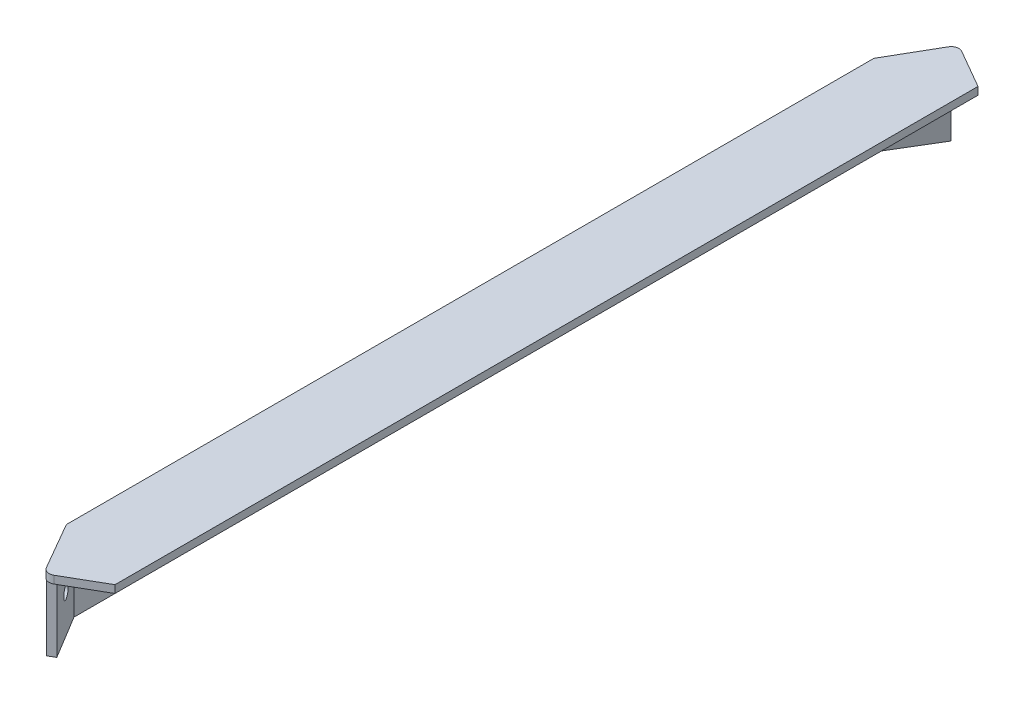
ISO-10303-21;
HEADER;
FILE_DESCRIPTION(('STEP AP214'),'2;1');
FILE_NAME('part.step','',(''),(''),'','','');
FILE_SCHEMA(('AUTOMOTIVE_DESIGN { 1 0 10303 214 1 1 1 1 }'));
ENDSEC;
DATA;
#1=APPLICATION_CONTEXT('core data for automotive mechanical design processes');
#2=APPLICATION_PROTOCOL_DEFINITION('international standard','automotive_design',2000,#1);
#3=PRODUCT_CONTEXT('',#1,'mechanical');
#4=PRODUCT('Part','Part','',(#3));
#5=PRODUCT_RELATED_PRODUCT_CATEGORY('part','',(#4));
#6=PRODUCT_DEFINITION_FORMATION('','',#4);
#7=PRODUCT_DEFINITION_CONTEXT('part definition',#1,'design');
#8=PRODUCT_DEFINITION('design','',#6,#7);
#9=PRODUCT_DEFINITION_SHAPE('','',#8);
#10=(LENGTH_UNIT() NAMED_UNIT(*) SI_UNIT(.MILLI.,.METRE.));
#11=(NAMED_UNIT(*) PLANE_ANGLE_UNIT() SI_UNIT($,.RADIAN.));
#12=(NAMED_UNIT(*) SI_UNIT($,.STERADIAN.) SOLID_ANGLE_UNIT());
#13=UNCERTAINTY_MEASURE_WITH_UNIT(LENGTH_MEASURE(1.E-05),#10,'distance_accuracy_value','');
#14=(GEOMETRIC_REPRESENTATION_CONTEXT(3) GLOBAL_UNCERTAINTY_ASSIGNED_CONTEXT((#13)) GLOBAL_UNIT_ASSIGNED_CONTEXT((#10,
#11,#12)) REPRESENTATION_CONTEXT('',''));
#15=CARTESIAN_POINT('',(0.,0.,0.));
#16=DIRECTION('',(0.,0.,1.));
#17=DIRECTION('',(1.,0.,0.));
#18=AXIS2_PLACEMENT_3D('',#15,#16,#17);
#19=CARTESIAN_POINT('',(7.,0.,370.));
#20=DIRECTION('',(0.,1.,0.));
#21=DIRECTION('',(-1.,0.,0.));
#22=AXIS2_PLACEMENT_3D('',#19,#20,#21);
#23=PLANE('',#22);
#24=DIRECTION('',(0.,0.,-1.));
#25=VECTOR('',#24,1.);
#26=CARTESIAN_POINT('',(0.,0.,370.));
#27=LINE('',#26,#25);
#28=CARTESIAN_POINT('',(0.,0.,370.));
#29=VERTEX_POINT('',#28);
#30=CARTESIAN_POINT('',(0.,0.,-370.));
#31=VERTEX_POINT('',#30);
#32=EDGE_CURVE('E305',#29,#31,#27,.T.);
#33=ORIENTED_EDGE('',*,*,#32,.T.);
#34=DIRECTION('',(0.499999999999995,0.,-0.866025403784442));
#35=VECTOR('',#34,1.);
#36=CARTESIAN_POINT('',(0.,0.,-370.));
#37=LINE('',#36,#35);
#38=CARTESIAN_POINT('',(24.9999999999997,0.,-413.301270189222));
#39=VERTEX_POINT('',#38);
#40=EDGE_CURVE('E165',#31,#39,#37,.T.);
#41=ORIENTED_EDGE('',*,*,#40,.T.);
#42=DIRECTION('',(0.866025403784445,0.,0.49999999999999));
#43=VECTOR('',#42,1.);
#44=CARTESIAN_POINT('',(24.9999999999997,0.,-413.301270189222));
#45=LINE('',#44,#43);
#46=CARTESIAN_POINT('',(31.0621778264906,0.,-409.801270189222));
#47=VERTEX_POINT('',#46);
#48=EDGE_CURVE('E209',#39,#47,#45,.T.);
#49=ORIENTED_EDGE('',*,*,#48,.T.);
#50=DIRECTION('',(-0.517360980401761,0.,0.855767267402609));
#51=VECTOR('',#50,1.);
#52=CARTESIAN_POINT('',(31.0621778264906,0.,-409.801270189222));
#53=LINE('',#52,#51);
#54=CARTESIAN_POINT('',(7.,0.,-370.));
#55=VERTEX_POINT('',#54);
#56=EDGE_CURVE('E205',#47,#55,#53,.T.);
#57=ORIENTED_EDGE('',*,*,#56,.T.);
#58=DIRECTION('',(0.,0.,-1.));
#59=VECTOR('',#58,1.);
#60=CARTESIAN_POINT('',(7.,0.,370.));
#61=LINE('',#60,#59);
#62=CARTESIAN_POINT('',(7.,0.,370.));
#63=VERTEX_POINT('',#62);
#64=EDGE_CURVE('E317',#63,#55,#61,.T.);
#65=ORIENTED_EDGE('',*,*,#64,.F.);
#66=DIRECTION('',(-0.517360980401761,0.,-0.855767267402609));
#67=VECTOR('',#66,1.);
#68=CARTESIAN_POINT('',(31.0621778264906,0.,409.801270189222));
#69=LINE('',#68,#67);
#70=CARTESIAN_POINT('',(31.0621778264906,0.,409.801270189222));
#71=VERTEX_POINT('',#70);
#72=EDGE_CURVE('E283',#71,#63,#69,.T.);
#73=ORIENTED_EDGE('',*,*,#72,.F.);
#74=DIRECTION('',(0.866025403784445,0.,-0.49999999999999));
#75=VECTOR('',#74,1.);
#76=CARTESIAN_POINT('',(24.9999999999997,0.,413.301270189222));
#77=LINE('',#76,#75);
#78=CARTESIAN_POINT('',(24.9999999999997,0.,413.301270189222));
#79=VERTEX_POINT('',#78);
#80=EDGE_CURVE('E286',#79,#71,#77,.T.);
#81=ORIENTED_EDGE('',*,*,#80,.F.);
#82=DIRECTION('',(0.499999999999995,0.,0.866025403784442));
#83=VECTOR('',#82,1.);
#84=CARTESIAN_POINT('',(0.,0.,370.));
#85=LINE('',#84,#83);
#86=EDGE_CURVE('E278',#29,#79,#85,.T.);
#87=ORIENTED_EDGE('',*,*,#86,.F.);
#88=EDGE_LOOP('',(#33,#41,#49,#57,#65,#73,#81,#87));
#89=FACE_BOUND('',#88,.T.);
#90=ADVANCED_FACE('F45',(#89),#23,.F.);
#91=CARTESIAN_POINT('',(6.99999999999999,63.,370.));
#92=DIRECTION('',(-1.,0.,0.));
#93=DIRECTION('',(0.,-1.,0.));
#94=AXIS2_PLACEMENT_3D('',#91,#92,#93);
#95=PLANE('',#94);
#96=ORIENTED_EDGE('',*,*,#64,.T.);
#97=DIRECTION('',(0.,1.,0.));
#98=VECTOR('',#97,1.);
#99=CARTESIAN_POINT('',(6.99999999999999,63.,-370.));
#100=LINE('',#99,#98);
#101=CARTESIAN_POINT('',(6.99999999999999,58.,-370.));
#102=VERTEX_POINT('',#101);
#103=EDGE_CURVE('E221',#55,#102,#100,.T.);
#104=ORIENTED_EDGE('',*,*,#103,.T.);
#105=DIRECTION('',(0.,0.,-1.));
#106=VECTOR('',#105,1.);
#107=CARTESIAN_POINT('',(6.99999999999999,58.,370.));
#108=LINE('',#107,#106);
#109=CARTESIAN_POINT('',(6.99999999999999,58.,370.));
#110=VERTEX_POINT('',#109);
#111=EDGE_CURVE('E55',#102,#110,#108,.F.);
#112=ORIENTED_EDGE('',*,*,#111,.T.);
#113=DIRECTION('',(0.,1.,0.));
#114=VECTOR('',#113,1.);
#115=CARTESIAN_POINT('',(6.99999999999999,63.,370.));
#116=LINE('',#115,#114);
#117=EDGE_CURVE('E299',#63,#110,#116,.T.);
#118=ORIENTED_EDGE('',*,*,#117,.F.);
#119=EDGE_LOOP('',(#96,#104,#112,#118));
#120=FACE_BOUND('',#119,.T.);
#121=ADVANCED_FACE('F355',(#120),#95,.F.);
#122=CARTESIAN_POINT('',(70.,63.,370.));
#123=DIRECTION('',(0.,1.,0.));
#124=DIRECTION('',(-1.,0.,0.));
#125=AXIS2_PLACEMENT_3D('',#122,#123,#124);
#126=PLANE('',#125);
#127=DIRECTION('',(0.866025403784445,0.,-0.49999999999999));
#128=VECTOR('',#127,1.);
#129=CARTESIAN_POINT('',(24.9999999999997,63.,413.301270189222));
#130=LINE('',#129,#128);
#131=CARTESIAN_POINT('',(24.9999999999997,63.,413.301270189222));
#132=VERTEX_POINT('',#131);
#133=CARTESIAN_POINT('',(35.3931854107218,63.,407.300761794604));
#134=VERTEX_POINT('',#133);
#135=EDGE_CURVE('E279',#132,#134,#130,.T.);
#136=ORIENTED_EDGE('',*,*,#135,.T.);
#137=DIRECTION('',(-0.517360980401761,0.,-0.855767267402609));
#138=VECTOR('',#137,1.);
#139=CARTESIAN_POINT('',(11.2788363370131,63.,367.413195097991));
#140=LINE('',#139,#138);
#141=CARTESIAN_POINT('',(12.,63.,368.606072567693));
#142=VERTEX_POINT('',#141);
#143=EDGE_CURVE('E323',#134,#142,#140,.T.);
#144=ORIENTED_EDGE('',*,*,#143,.T.);
#145=DIRECTION('',(0.,0.,-1.));
#146=VECTOR('',#145,1.);
#147=CARTESIAN_POINT('',(12.,63.,0.));
#148=LINE('',#147,#146);
#149=CARTESIAN_POINT('',(12.,63.,-368.606072567693));
#150=VERTEX_POINT('',#149);
#151=EDGE_CURVE('E320',#142,#150,#148,.T.);
#152=ORIENTED_EDGE('',*,*,#151,.T.);
#153=DIRECTION('',(-0.517360980401761,0.,0.855767267402609));
#154=VECTOR('',#153,1.);
#155=CARTESIAN_POINT('',(11.2788363370131,63.,-367.413195097991));
#156=LINE('',#155,#154);
#157=CARTESIAN_POINT('',(35.3931854107218,63.,-407.300761794604));
#158=VERTEX_POINT('',#157);
#159=EDGE_CURVE('E226',#158,#150,#156,.T.);
#160=ORIENTED_EDGE('',*,*,#159,.F.);
#161=DIRECTION('',(0.866025403784445,0.,0.49999999999999));
#162=VECTOR('',#161,1.);
#163=CARTESIAN_POINT('',(24.9999999999997,63.,-413.301270189222));
#164=LINE('',#163,#162);
#165=CARTESIAN_POINT('',(24.9999999999997,63.,-413.301270189222));
#166=VERTEX_POINT('',#165);
#167=EDGE_CURVE('E200',#166,#158,#164,.T.);
#168=ORIENTED_EDGE('',*,*,#167,.F.);
#169=CARTESIAN_POINT('',(31.0621778264908,63.,-409.801270189222));
#170=DIRECTION('',(0.,-1.,0.));
#171=DIRECTION('',(0.,0.,-1.));
#172=AXIS2_PLACEMENT_3D('',#169,#170,#171);
#173=CIRCLE('',#172,7.00000000000001);
#174=CARTESIAN_POINT('',(34.5621778264907,63.,-415.863448015713));
#175=VERTEX_POINT('',#174);
#176=EDGE_CURVE('E161',#166,#175,#173,.T.);
#177=ORIENTED_EDGE('',*,*,#176,.T.);
#178=DIRECTION('',(0.866025403784439,0.,0.499999999999999));
#179=VECTOR('',#178,1.);
#180=CARTESIAN_POINT('',(34.5621778264908,63.,-415.863448015713));
#181=LINE('',#180,#179);
#182=CARTESIAN_POINT('',(69.9999999999999,63.,-395.403411844343));
#183=VERTEX_POINT('',#182);
#184=EDGE_CURVE('E177',#175,#183,#181,.T.);
#185=ORIENTED_EDGE('',*,*,#184,.T.);
#186=DIRECTION('',(0.,0.,-1.));
#187=VECTOR('',#186,1.);
#188=CARTESIAN_POINT('',(70.,63.,370.));
#189=LINE('',#188,#187);
#190=CARTESIAN_POINT('',(69.9999999999999,63.,395.403411844343));
#191=VERTEX_POINT('',#190);
#192=EDGE_CURVE('E314',#191,#183,#189,.T.);
#193=ORIENTED_EDGE('',*,*,#192,.F.);
#194=DIRECTION('',(0.866025403784439,0.,-0.499999999999999));
#195=VECTOR('',#194,1.);
#196=CARTESIAN_POINT('',(34.5621778264908,63.,415.863448015713));
#197=LINE('',#196,#195);
#198=CARTESIAN_POINT('',(34.5621778264907,63.,415.863448015713));
#199=VERTEX_POINT('',#198);
#200=EDGE_CURVE('E254',#199,#191,#197,.T.);
#201=ORIENTED_EDGE('',*,*,#200,.F.);
#202=CARTESIAN_POINT('',(31.0621778264908,63.,409.801270189222));
#203=DIRECTION('',(0.,1.,0.));
#204=DIRECTION('',(0.,0.,1.));
#205=AXIS2_PLACEMENT_3D('',#202,#203,#204);
#206=CIRCLE('',#205,7.00000000000001);
#207=EDGE_CURVE('E249',#132,#199,#206,.T.);
#208=ORIENTED_EDGE('',*,*,#207,.F.);
#209=EDGE_LOOP('',(#136,#144,#152,#160,#168,#177,#185,#193,#201,#208));
#210=FACE_BOUND('',#209,.T.);
#211=ADVANCED_FACE('F341',(#210),#126,.F.);
#212=CARTESIAN_POINT('',(70.,70.,370.));
#213=DIRECTION('',(-1.,0.,0.));
#214=DIRECTION('',(0.,0.,1.));
#215=AXIS2_PLACEMENT_3D('',#212,#213,#214);
#216=PLANE('',#215);
#217=ORIENTED_EDGE('',*,*,#192,.T.);
#218=DIRECTION('',(0.,-1.,0.));
#219=VECTOR('',#218,1.);
#220=CARTESIAN_POINT('',(69.9999999999999,70.,-395.403411844343));
#221=LINE('',#220,#219);
#222=CARTESIAN_POINT('',(69.9999999999999,70.,-395.403411844343));
#223=VERTEX_POINT('',#222);
#224=EDGE_CURVE('E185',#223,#183,#221,.T.);
#225=ORIENTED_EDGE('',*,*,#224,.F.);
#226=DIRECTION('',(0.,0.,-1.));
#227=VECTOR('',#226,1.);
#228=CARTESIAN_POINT('',(70.,70.,370.));
#229=LINE('',#228,#227);
#230=CARTESIAN_POINT('',(69.9999999999999,70.,395.403411844343));
#231=VERTEX_POINT('',#230);
#232=EDGE_CURVE('E311',#231,#223,#229,.T.);
#233=ORIENTED_EDGE('',*,*,#232,.F.);
#234=DIRECTION('',(0.,-1.,0.));
#235=VECTOR('',#234,1.);
#236=CARTESIAN_POINT('',(69.9999999999999,70.,395.403411844343));
#237=LINE('',#236,#235);
#238=EDGE_CURVE('E261',#231,#191,#237,.T.);
#239=ORIENTED_EDGE('',*,*,#238,.T.);
#240=EDGE_LOOP('',(#217,#225,#233,#239));
#241=FACE_BOUND('',#240,.T.);
#242=ADVANCED_FACE('F387',(#241),#216,.F.);
#243=CARTESIAN_POINT('',(0.,70.,370.));
#244=DIRECTION('',(0.,-1.,0.));
#245=DIRECTION('',(0.,0.,-1.));
#246=AXIS2_PLACEMENT_3D('',#243,#244,#245);
#247=PLANE('',#246);
#248=ORIENTED_EDGE('',*,*,#232,.T.);
#249=DIRECTION('',(0.866025403784439,0.,0.499999999999999));
#250=VECTOR('',#249,1.);
#251=CARTESIAN_POINT('',(34.5621778264908,70.,-415.863448015713));
#252=LINE('',#251,#250);
#253=CARTESIAN_POINT('',(34.5621778264907,70.,-415.863448015713));
#254=VERTEX_POINT('',#253);
#255=EDGE_CURVE('E181',#254,#223,#252,.T.);
#256=ORIENTED_EDGE('',*,*,#255,.F.);
#257=CARTESIAN_POINT('',(31.0621778264908,70.,-409.801270189222));
#258=DIRECTION('',(0.,-1.,0.));
#259=DIRECTION('',(0.,0.,-1.));
#260=AXIS2_PLACEMENT_3D('',#257,#258,#259);
#261=CIRCLE('',#260,7.00000000000001);
#262=CARTESIAN_POINT('',(24.9999999999997,70.,-413.301270189222));
#263=VERTEX_POINT('',#262);
#264=EDGE_CURVE('E158',#263,#254,#261,.T.);
#265=ORIENTED_EDGE('',*,*,#264,.F.);
#266=DIRECTION('',(0.499999999999996,0.,-0.866025403784441));
#267=VECTOR('',#266,1.);
#268=CARTESIAN_POINT('',(0.,70.,-370.));
#269=LINE('',#268,#267);
#270=CARTESIAN_POINT('',(0.,70.,-370.));
#271=VERTEX_POINT('',#270);
#272=EDGE_CURVE('E170',#271,#263,#269,.T.);
#273=ORIENTED_EDGE('',*,*,#272,.F.);
#274=DIRECTION('',(0.,0.,-1.));
#275=VECTOR('',#274,1.);
#276=CARTESIAN_POINT('',(0.,70.,370.));
#277=LINE('',#276,#275);
#278=CARTESIAN_POINT('',(0.,70.,370.));
#279=VERTEX_POINT('',#278);
#280=EDGE_CURVE('E308',#279,#271,#277,.T.);
#281=ORIENTED_EDGE('',*,*,#280,.F.);
#282=DIRECTION('',(0.499999999999996,0.,0.866025403784441));
#283=VECTOR('',#282,1.);
#284=CARTESIAN_POINT('',(0.,70.,370.));
#285=LINE('',#284,#283);
#286=CARTESIAN_POINT('',(24.9999999999997,70.,413.301270189222));
#287=VERTEX_POINT('',#286);
#288=EDGE_CURVE('E250',#279,#287,#285,.T.);
#289=ORIENTED_EDGE('',*,*,#288,.T.);
#290=CARTESIAN_POINT('',(31.0621778264908,70.,409.801270189222));
#291=DIRECTION('',(0.,1.,0.));
#292=DIRECTION('',(0.,0.,1.));
#293=AXIS2_PLACEMENT_3D('',#290,#291,#292);
#294=CIRCLE('',#293,7.00000000000001);
#295=CARTESIAN_POINT('',(34.5621778264907,70.,415.863448015713));
#296=VERTEX_POINT('',#295);
#297=EDGE_CURVE('E253',#287,#296,#294,.T.);
#298=ORIENTED_EDGE('',*,*,#297,.T.);
#299=DIRECTION('',(0.866025403784439,0.,-0.499999999999999));
#300=VECTOR('',#299,1.);
#301=CARTESIAN_POINT('',(34.5621778264908,70.,415.863448015713));
#302=LINE('',#301,#300);
#303=EDGE_CURVE('E257',#296,#231,#302,.T.);
#304=ORIENTED_EDGE('',*,*,#303,.T.);
#305=EDGE_LOOP('',(#248,#256,#265,#273,#281,#289,#298,#304));
#306=FACE_BOUND('',#305,.T.);
#307=ADVANCED_FACE('F179',(#306),#247,.F.);
#308=CARTESIAN_POINT('',(0.,0.,370.));
#309=DIRECTION('',(1.,0.,0.));
#310=DIRECTION('',(0.,0.,-1.));
#311=AXIS2_PLACEMENT_3D('',#308,#309,#310);
#312=PLANE('',#311);
#313=ORIENTED_EDGE('',*,*,#280,.T.);
#314=DIRECTION('',(0.,-1.,0.));
#315=VECTOR('',#314,1.);
#316=CARTESIAN_POINT('',(0.,0.,-370.));
#317=LINE('',#316,#315);
#318=EDGE_CURVE('E174',#271,#31,#317,.T.);
#319=ORIENTED_EDGE('',*,*,#318,.T.);
#320=ORIENTED_EDGE('',*,*,#32,.F.);
#321=DIRECTION('',(0.,-1.,0.));
#322=VECTOR('',#321,1.);
#323=CARTESIAN_POINT('',(0.,0.,370.));
#324=LINE('',#323,#322);
#325=EDGE_CURVE('E302',#279,#29,#324,.T.);
#326=ORIENTED_EDGE('',*,*,#325,.F.);
#327=EDGE_LOOP('',(#313,#319,#320,#326));
#328=FACE_BOUND('',#327,.T.);
#329=ADVANCED_FACE('F369',(#328),#312,.F.);
#330=CARTESIAN_POINT('',(0.,63.,370.));
#331=DIRECTION('',(0.866025403784442,0.,-0.499999999999995));
#332=DIRECTION('',(-0.499999999999995,0.,-0.866025403784442));
#333=AXIS2_PLACEMENT_3D('',#330,#331,#332);
#334=PLANE('',#333);
#335=CARTESIAN_POINT('',(12.568046792657,35.,391.768495596785));
#336=DIRECTION('',(0.866025403784442,0.,-0.499999999999995));
#337=DIRECTION('',(-0.499999999999995,0.,-0.866025403784442));
#338=AXIS2_PLACEMENT_3D('',#335,#336,#337);
#339=ELLIPSE('',#338,6.00122014708367,6.00000000000002);
#340=CARTESIAN_POINT('',(9.56743671911518,35.,386.571286495708));
#341=VERTEX_POINT('',#340);
#342=EDGE_CURVE('E245',#341,#341,#339,.T.);
#343=ORIENTED_EDGE('',*,*,#342,.T.);
#344=EDGE_LOOP('',(#343));
#345=FACE_BOUND('',#344,.T.);
#346=ORIENTED_EDGE('',*,*,#86,.T.);
#347=DIRECTION('',(0.,-1.,0.));
#348=VECTOR('',#347,1.);
#349=CARTESIAN_POINT('',(24.9999999999997,63.,413.301270189222));
#350=LINE('',#349,#348);
#351=EDGE_CURVE('E295',#132,#79,#350,.T.);
#352=ORIENTED_EDGE('',*,*,#351,.F.);
#353=DIRECTION('',(0.,-1.,0.));
#354=VECTOR('',#353,1.);
#355=CARTESIAN_POINT('',(24.9999999999997,70.,413.301270189222));
#356=LINE('',#355,#354);
#357=EDGE_CURVE('E274',#287,#132,#356,.T.);
#358=ORIENTED_EDGE('',*,*,#357,.F.);
#359=ORIENTED_EDGE('',*,*,#288,.F.);
#360=ORIENTED_EDGE('',*,*,#325,.T.);
#361=EDGE_LOOP('',(#346,#352,#358,#359,#360));
#362=FACE_BOUND('',#361,.T.);
#363=ADVANCED_FACE('F375',(#345,#362),#334,.F.);
#364=CARTESIAN_POINT('',(24.9999999999997,63.,413.301270189222));
#365=DIRECTION('',(-0.49999999999999,0.,-0.866025403784445));
#366=DIRECTION('',(-0.866025403784445,0.,0.49999999999999));
#367=AXIS2_PLACEMENT_3D('',#364,#365,#366);
#368=PLANE('',#367);
#369=ORIENTED_EDGE('',*,*,#80,.T.);
#370=DIRECTION('',(0.,-1.,0.));
#371=VECTOR('',#370,1.);
#372=CARTESIAN_POINT('',(31.0621778264906,63.,409.801270189222));
#373=LINE('',#372,#371);
#374=CARTESIAN_POINT('',(31.0621778264906,58.,409.801270189222));
#375=VERTEX_POINT('',#374);
#376=EDGE_CURVE('E282',#375,#71,#373,.T.);
#377=ORIENTED_EDGE('',*,*,#376,.F.);
#378=CARTESIAN_POINT('',(35.3931854107218,58.,407.300761794604));
#379=DIRECTION('',(-0.49999999999999,0.,-0.866025403784445));
#380=DIRECTION('',(0.866025403784445,0.,-0.49999999999999));
#381=AXIS2_PLACEMENT_3D('',#378,#379,#380);
#382=ELLIPSE('',#381,5.00101678923638,5.);
#383=EDGE_CURVE('E11',#375,#134,#382,.T.);
#384=ORIENTED_EDGE('',*,*,#383,.T.);
#385=ORIENTED_EDGE('',*,*,#135,.F.);
#386=ORIENTED_EDGE('',*,*,#351,.T.);
#387=EDGE_LOOP('',(#369,#377,#384,#385,#386));
#388=FACE_BOUND('',#387,.T.);
#389=ADVANCED_FACE('F346',(#388),#368,.F.);
#390=CARTESIAN_POINT('',(31.0621778264906,63.,409.801270189222));
#391=DIRECTION('',(-0.855767267402609,0.,0.517360980401761));
#392=DIRECTION('',(0.517360980401761,0.,0.855767267402609));
#393=AXIS2_PLACEMENT_3D('',#390,#391,#392);
#394=PLANE('',#393);
#395=CARTESIAN_POINT('',(18.1281533164472,35.,388.407088504157));
#396=DIRECTION('',(0.855767267402608,0.,-0.517360980401763));
#397=DIRECTION('',(-0.517360980401763,0.,-0.855767267402608));
#398=AXIS2_PLACEMENT_3D('',#395,#396,#397);
#399=CIRCLE('',#398,6.00000000000002);
#400=CARTESIAN_POINT('',(15.0239874340366,35.,383.272484899741));
#401=VERTEX_POINT('',#400);
#402=EDGE_CURVE('E241',#401,#401,#399,.T.);
#403=ORIENTED_EDGE('',*,*,#402,.F.);
#404=EDGE_LOOP('',(#403));
#405=FACE_BOUND('',#404,.T.);
#406=ORIENTED_EDGE('',*,*,#117,.T.);
#407=DIRECTION('',(-0.517360980401761,0.,-0.855767267402609));
#408=VECTOR('',#407,1.);
#409=CARTESIAN_POINT('',(31.0621778264906,58.,409.801270189222));
#410=LINE('',#409,#408);
#411=EDGE_CURVE('E62',#110,#375,#410,.F.);
#412=ORIENTED_EDGE('',*,*,#411,.T.);
#413=ORIENTED_EDGE('',*,*,#376,.T.);
#414=ORIENTED_EDGE('',*,*,#72,.T.);
#415=EDGE_LOOP('',(#406,#412,#413,#414));
#416=FACE_BOUND('',#415,.T.);
#417=ADVANCED_FACE('F349',(#405,#416),#394,.F.);
#418=CARTESIAN_POINT('',(31.0621778264908,70.,409.801270189222));
#419=DIRECTION('',(0.,-1.,0.));
#420=DIRECTION('',(0.,0.,-1.));
#421=AXIS2_PLACEMENT_3D('',#418,#419,#420);
#422=CYLINDRICAL_SURFACE('',#421,7.00000000000001);
#423=ORIENTED_EDGE('',*,*,#207,.T.);
#424=DIRECTION('',(0.,-1.,0.));
#425=VECTOR('',#424,1.);
#426=CARTESIAN_POINT('',(34.5621778264907,70.,415.863448015713));
#427=LINE('',#426,#425);
#428=EDGE_CURVE('E270',#296,#199,#427,.T.);
#429=ORIENTED_EDGE('',*,*,#428,.F.);
#430=ORIENTED_EDGE('',*,*,#297,.F.);
#431=ORIENTED_EDGE('',*,*,#357,.T.);
#432=EDGE_LOOP('',(#423,#429,#430,#431));
#433=FACE_BOUND('',#432,.T.);
#434=ADVANCED_FACE('F377',(#433),#422,.T.);
#435=CARTESIAN_POINT('',(34.5621778264908,70.,415.863448015713));
#436=DIRECTION('',(-0.499999999999999,0.,-0.866025403784439));
#437=DIRECTION('',(-0.866025403784439,0.,0.499999999999999));
#438=AXIS2_PLACEMENT_3D('',#435,#436,#437);
#439=PLANE('',#438);
#440=ORIENTED_EDGE('',*,*,#200,.T.);
#441=ORIENTED_EDGE('',*,*,#238,.F.);
#442=ORIENTED_EDGE('',*,*,#303,.F.);
#443=ORIENTED_EDGE('',*,*,#428,.T.);
#444=EDGE_LOOP('',(#440,#441,#442,#443));
#445=FACE_BOUND('',#444,.T.);
#446=ADVANCED_FACE('F381',(#445),#439,.F.);
#447=CARTESIAN_POINT('',(12.137782444629,35.,392.028615366969));
#448=DIRECTION('',(0.855767267402608,0.,-0.517360980401763));
#449=DIRECTION('',(-0.517360980401763,0.,-0.855767267402608));
#450=AXIS2_PLACEMENT_3D('',#447,#448,#449);
#451=CYLINDRICAL_SURFACE('',#450,6.00000000000002);
#452=ORIENTED_EDGE('',*,*,#402,.T.);
#453=EDGE_LOOP('',(#452));
#454=FACE_BOUND('',#453,.T.);
#455=ORIENTED_EDGE('',*,*,#342,.F.);
#456=EDGE_LOOP('',(#455));
#457=FACE_BOUND('',#456,.T.);
#458=ADVANCED_FACE('F412',(#454,#457),#451,.F.);
#459=CARTESIAN_POINT('',(12.,58.,370.));
#460=DIRECTION('',(0.,0.,1.));
#461=DIRECTION('',(1.,0.,0.));
#462=AXIS2_PLACEMENT_3D('',#459,#460,#461);
#463=CYLINDRICAL_SURFACE('',#462,5.);
#464=ORIENTED_EDGE('',*,*,#111,.F.);
#465=CARTESIAN_POINT('',(12.,58.,-368.606072567693));
#466=DIRECTION('',(-0.268544905553421,0.,0.963267166315402));
#467=DIRECTION('',(0.963267166315402,0.,0.268544905553421));
#468=AXIS2_PLACEMENT_3D('',#465,#466,#467);
#469=ELLIPSE('',#468,5.19066794223406,5.);
#470=EDGE_CURVE('E236',#102,#150,#469,.F.);
#471=ORIENTED_EDGE('',*,*,#470,.T.);
#472=ORIENTED_EDGE('',*,*,#151,.F.);
#473=CARTESIAN_POINT('',(12.,58.,368.606072567693));
#474=DIRECTION('',(0.268544905553421,0.,0.963267166315402));
#475=DIRECTION('',(0.963267166315402,0.,-0.268544905553421));
#476=AXIS2_PLACEMENT_3D('',#473,#474,#475);
#477=ELLIPSE('',#476,5.19066794223406,5.);
#478=EDGE_CURVE('E49',#110,#142,#477,.F.);
#479=ORIENTED_EDGE('',*,*,#478,.F.);
#480=EDGE_LOOP('',(#464,#471,#472,#479));
#481=FACE_BOUND('',#480,.T.);
#482=ADVANCED_FACE('F47',(#481),#463,.F.);
#483=CARTESIAN_POINT('',(28.1415665316762,58.,395.305852422918));
#484=DIRECTION('',(0.517360980401761,0.,0.855767267402609));
#485=DIRECTION('',(0.855767267402609,0.,-0.517360980401761));
#486=AXIS2_PLACEMENT_3D('',#483,#484,#485);
#487=CYLINDRICAL_SURFACE('',#486,5.);
#488=ORIENTED_EDGE('',*,*,#383,.F.);
#489=ORIENTED_EDGE('',*,*,#411,.F.);
#490=ORIENTED_EDGE('',*,*,#478,.T.);
#491=ORIENTED_EDGE('',*,*,#143,.F.);
#492=EDGE_LOOP('',(#488,#489,#490,#491));
#493=FACE_BOUND('',#492,.T.);
#494=ADVANCED_FACE('F336',(#493),#487,.F.);
#495=CARTESIAN_POINT('',(0.,63.,-370.));
#496=DIRECTION('',(0.866025403784442,0.,0.499999999999995));
#497=DIRECTION('',(-0.499999999999995,0.,0.866025403784442));
#498=AXIS2_PLACEMENT_3D('',#495,#496,#497);
#499=PLANE('',#498);
#500=CARTESIAN_POINT('',(12.568046792657,35.,-391.768495596785));
#501=DIRECTION('',(-0.866025403784442,0.,-0.499999999999995));
#502=DIRECTION('',(-0.499999999999995,0.,0.866025403784442));
#503=AXIS2_PLACEMENT_3D('',#500,#501,#502);
#504=ELLIPSE('',#503,6.00122014708367,6.00000000000002);
#505=CARTESIAN_POINT('',(9.56743671911518,35.,-386.571286495708));
#506=VERTEX_POINT('',#505);
#507=EDGE_CURVE('E191',#506,#506,#504,.T.);
#508=ORIENTED_EDGE('',*,*,#507,.F.);
#509=EDGE_LOOP('',(#508));
#510=FACE_BOUND('',#509,.T.);
#511=ORIENTED_EDGE('',*,*,#40,.F.);
#512=ORIENTED_EDGE('',*,*,#318,.F.);
#513=ORIENTED_EDGE('',*,*,#272,.T.);
#514=DIRECTION('',(0.,-1.,0.));
#515=VECTOR('',#514,1.);
#516=CARTESIAN_POINT('',(24.9999999999997,70.,-413.301270189222));
#517=LINE('',#516,#515);
#518=EDGE_CURVE('E154',#263,#166,#517,.T.);
#519=ORIENTED_EDGE('',*,*,#518,.T.);
#520=DIRECTION('',(0.,-1.,0.));
#521=VECTOR('',#520,1.);
#522=CARTESIAN_POINT('',(24.9999999999997,63.,-413.301270189222));
#523=LINE('',#522,#521);
#524=EDGE_CURVE('E218',#166,#39,#523,.T.);
#525=ORIENTED_EDGE('',*,*,#524,.T.);
#526=EDGE_LOOP('',(#511,#512,#513,#519,#525));
#527=FACE_BOUND('',#526,.T.);
#528=ADVANCED_FACE('F172',(#510,#527),#499,.F.);
#529=CARTESIAN_POINT('',(24.9999999999997,63.,-413.301270189222));
#530=DIRECTION('',(-0.49999999999999,0.,0.866025403784445));
#531=DIRECTION('',(-0.866025403784445,0.,-0.49999999999999));
#532=AXIS2_PLACEMENT_3D('',#529,#530,#531);
#533=PLANE('',#532);
#534=ORIENTED_EDGE('',*,*,#48,.F.);
#535=ORIENTED_EDGE('',*,*,#524,.F.);
#536=ORIENTED_EDGE('',*,*,#167,.T.);
#537=CARTESIAN_POINT('',(35.3931854107218,58.,-407.300761794604));
#538=DIRECTION('',(0.49999999999999,0.,-0.866025403784445));
#539=DIRECTION('',(0.866025403784445,0.,0.49999999999999));
#540=AXIS2_PLACEMENT_3D('',#537,#538,#539);
#541=ELLIPSE('',#540,5.00101678923638,5.);
#542=CARTESIAN_POINT('',(31.0621778264906,58.,-409.801270189222));
#543=VERTEX_POINT('',#542);
#544=EDGE_CURVE('E233',#543,#158,#541,.T.);
#545=ORIENTED_EDGE('',*,*,#544,.F.);
#546=DIRECTION('',(0.,-1.,0.));
#547=VECTOR('',#546,1.);
#548=CARTESIAN_POINT('',(31.0621778264906,63.,-409.801270189222));
#549=LINE('',#548,#547);
#550=EDGE_CURVE('E204',#543,#47,#549,.T.);
#551=ORIENTED_EDGE('',*,*,#550,.T.);
#552=EDGE_LOOP('',(#534,#535,#536,#545,#551));
#553=FACE_BOUND('',#552,.T.);
#554=ADVANCED_FACE('F365',(#553),#533,.F.);
#555=CARTESIAN_POINT('',(31.0621778264906,63.,-409.801270189222));
#556=DIRECTION('',(-0.855767267402609,0.,-0.517360980401761));
#557=DIRECTION('',(0.517360980401761,0.,-0.855767267402609));
#558=AXIS2_PLACEMENT_3D('',#555,#556,#557);
#559=PLANE('',#558);
#560=CARTESIAN_POINT('',(18.1281533164472,35.,-388.407088504157));
#561=DIRECTION('',(-0.855767267402608,0.,-0.517360980401763));
#562=DIRECTION('',(-0.517360980401763,0.,0.855767267402608));
#563=AXIS2_PLACEMENT_3D('',#560,#561,#562);
#564=CIRCLE('',#563,6.00000000000002);
#565=CARTESIAN_POINT('',(15.0239874340366,35.,-383.272484899741));
#566=VERTEX_POINT('',#565);
#567=EDGE_CURVE('E240',#566,#566,#564,.T.);
#568=ORIENTED_EDGE('',*,*,#567,.T.);
#569=EDGE_LOOP('',(#568));
#570=FACE_BOUND('',#569,.T.);
#571=ORIENTED_EDGE('',*,*,#103,.F.);
#572=ORIENTED_EDGE('',*,*,#56,.F.);
#573=ORIENTED_EDGE('',*,*,#550,.F.);
#574=DIRECTION('',(-0.517360980401761,0.,0.855767267402609));
#575=VECTOR('',#574,1.);
#576=CARTESIAN_POINT('',(31.0621778264906,58.,-409.801270189222));
#577=LINE('',#576,#575);
#578=EDGE_CURVE('E230',#102,#543,#577,.F.);
#579=ORIENTED_EDGE('',*,*,#578,.F.);
#580=EDGE_LOOP('',(#571,#572,#573,#579));
#581=FACE_BOUND('',#580,.T.);
#582=ADVANCED_FACE('F358',(#570,#581),#559,.F.);
#583=CARTESIAN_POINT('',(31.0621778264908,70.,-409.801270189222));
#584=DIRECTION('',(0.,-1.,0.));
#585=DIRECTION('',(0.,0.,1.));
#586=AXIS2_PLACEMENT_3D('',#583,#584,#585);
#587=CYLINDRICAL_SURFACE('',#586,7.00000000000001);
#588=ORIENTED_EDGE('',*,*,#176,.F.);
#589=ORIENTED_EDGE('',*,*,#518,.F.);
#590=ORIENTED_EDGE('',*,*,#264,.T.);
#591=DIRECTION('',(0.,-1.,0.));
#592=VECTOR('',#591,1.);
#593=CARTESIAN_POINT('',(34.5621778264907,70.,-415.863448015713));
#594=LINE('',#593,#592);
#595=EDGE_CURVE('E166',#254,#175,#594,.T.);
#596=ORIENTED_EDGE('',*,*,#595,.T.);
#597=EDGE_LOOP('',(#588,#589,#590,#596));
#598=FACE_BOUND('',#597,.T.);
#599=ADVANCED_FACE('F156',(#598),#587,.T.);
#600=CARTESIAN_POINT('',(34.5621778264908,70.,-415.863448015713));
#601=DIRECTION('',(-0.499999999999999,0.,0.866025403784439));
#602=DIRECTION('',(-0.866025403784439,0.,-0.499999999999999));
#603=AXIS2_PLACEMENT_3D('',#600,#601,#602);
#604=PLANE('',#603);
#605=ORIENTED_EDGE('',*,*,#184,.F.);
#606=ORIENTED_EDGE('',*,*,#595,.F.);
#607=ORIENTED_EDGE('',*,*,#255,.T.);
#608=ORIENTED_EDGE('',*,*,#224,.T.);
#609=EDGE_LOOP('',(#605,#606,#607,#608));
#610=FACE_BOUND('',#609,.T.);
#611=ADVANCED_FACE('F386',(#610),#604,.F.);
#612=CARTESIAN_POINT('',(12.137782444629,35.,-392.028615366969));
#613=DIRECTION('',(0.855767267402608,0.,0.517360980401763));
#614=DIRECTION('',(-0.517360980401763,0.,0.855767267402608));
#615=AXIS2_PLACEMENT_3D('',#612,#613,#614);
#616=CYLINDRICAL_SURFACE('',#615,6.00000000000002);
#617=ORIENTED_EDGE('',*,*,#567,.F.);
#618=EDGE_LOOP('',(#617));
#619=FACE_BOUND('',#618,.T.);
#620=ORIENTED_EDGE('',*,*,#507,.T.);
#621=EDGE_LOOP('',(#620));
#622=FACE_BOUND('',#621,.T.);
#623=ADVANCED_FACE('F591',(#619,#622),#616,.F.);
#624=CARTESIAN_POINT('',(28.1415665316762,58.,-395.305852422918));
#625=DIRECTION('',(0.517360980401761,0.,-0.855767267402609));
#626=DIRECTION('',(0.855767267402609,0.,0.517360980401761));
#627=AXIS2_PLACEMENT_3D('',#624,#625,#626);
#628=CYLINDRICAL_SURFACE('',#627,5.);
#629=ORIENTED_EDGE('',*,*,#544,.T.);
#630=ORIENTED_EDGE('',*,*,#159,.T.);
#631=ORIENTED_EDGE('',*,*,#470,.F.);
#632=ORIENTED_EDGE('',*,*,#578,.T.);
#633=EDGE_LOOP('',(#629,#630,#631,#632));
#634=FACE_BOUND('',#633,.T.);
#635=ADVANCED_FACE('F362',(#634),#628,.F.);
#636=CLOSED_SHELL('',(#90,#121,#211,#242,#307,#329,#363,#389,#417,#434,#446,#458,#482,#494,#528,
#554,#582,#599,#611,#623,#635));
#637=MANIFOLD_SOLID_BREP('B2',#636);
#638=ADVANCED_BREP_SHAPE_REPRESENTATION('',(#18,#637),#14);
#639=SHAPE_DEFINITION_REPRESENTATION(#9,#638);
ENDSEC;
END-ISO-10303-21;
